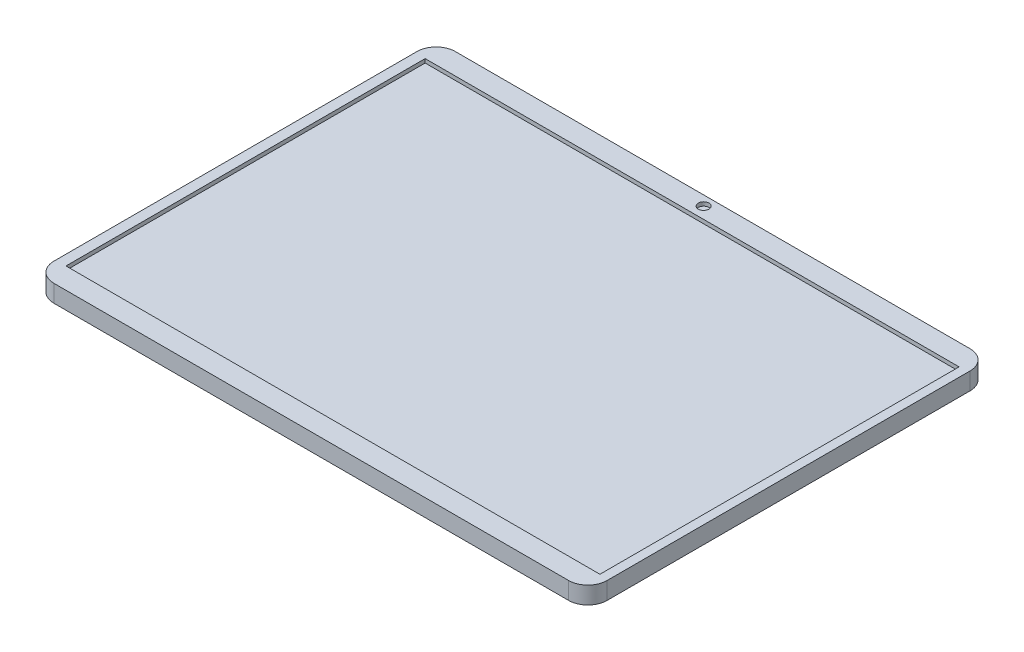
ISO-10303-21;
HEADER;
FILE_DESCRIPTION(('STEP AP214'),'2;1');
FILE_NAME('part.step','',(''),(''),'','','');
FILE_SCHEMA(('AUTOMOTIVE_DESIGN { 1 0 10303 214 1 1 1 1 }'));
ENDSEC;
DATA;
#1=APPLICATION_CONTEXT('core data for automotive mechanical design processes');
#2=APPLICATION_PROTOCOL_DEFINITION('international standard','automotive_design',2000,#1);
#3=PRODUCT_CONTEXT('',#1,'mechanical');
#4=PRODUCT('Part','Part','',(#3));
#5=PRODUCT_RELATED_PRODUCT_CATEGORY('part','',(#4));
#6=PRODUCT_DEFINITION_FORMATION('','',#4);
#7=PRODUCT_DEFINITION_CONTEXT('part definition',#1,'design');
#8=PRODUCT_DEFINITION('design','',#6,#7);
#9=PRODUCT_DEFINITION_SHAPE('','',#8);
#10=(LENGTH_UNIT() NAMED_UNIT(*) SI_UNIT(.MILLI.,.METRE.));
#11=(NAMED_UNIT(*) PLANE_ANGLE_UNIT() SI_UNIT($,.RADIAN.));
#12=(NAMED_UNIT(*) SI_UNIT($,.STERADIAN.) SOLID_ANGLE_UNIT());
#13=UNCERTAINTY_MEASURE_WITH_UNIT(LENGTH_MEASURE(1.E-05),#10,'distance_accuracy_value','');
#14=(GEOMETRIC_REPRESENTATION_CONTEXT(3) GLOBAL_UNCERTAINTY_ASSIGNED_CONTEXT((#13)) GLOBAL_UNIT_ASSIGNED_CONTEXT((#10,
#11,#12)) REPRESENTATION_CONTEXT('',''));
#15=CARTESIAN_POINT('',(0.,0.,0.));
#16=DIRECTION('',(0.,0.,1.));
#17=DIRECTION('',(1.,0.,0.));
#18=AXIS2_PLACEMENT_3D('',#15,#16,#17);
#19=CARTESIAN_POINT('',(-187.6,9.,-61.7999999999999));
#20=DIRECTION('',(1.,0.,0.));
#21=DIRECTION('',(0.,0.,-1.));
#22=AXIS2_PLACEMENT_3D('',#19,#20,#21);
#23=PLANE('',#22);
#24=DIRECTION('',(0.,1.,0.));
#25=VECTOR('',#24,1.);
#26=CARTESIAN_POINT('',(-187.6,0.,13.2));
#27=LINE('',#26,#25);
#28=CARTESIAN_POINT('',(-187.6,2.5,13.2));
#29=VERTEX_POINT('',#28);
#30=CARTESIAN_POINT('',(-187.6,6.5,13.2));
#31=VERTEX_POINT('',#30);
#32=EDGE_CURVE('E61',#29,#31,#27,.T.);
#33=ORIENTED_EDGE('',*,*,#32,.T.);
#34=DIRECTION('',(0.,0.,-1.));
#35=VECTOR('',#34,1.);
#36=CARTESIAN_POINT('',(-187.6,6.5,0.));
#37=LINE('',#36,#35);
#38=CARTESIAN_POINT('',(-187.6,6.5,23.2));
#39=VERTEX_POINT('',#38);
#40=EDGE_CURVE('E221',#39,#31,#37,.T.);
#41=ORIENTED_EDGE('',*,*,#40,.F.);
#42=DIRECTION('',(0.,1.,0.));
#43=VECTOR('',#42,1.);
#44=CARTESIAN_POINT('',(-187.6,0.,23.2));
#45=LINE('',#44,#43);
#46=CARTESIAN_POINT('',(-187.6,2.5,23.2));
#47=VERTEX_POINT('',#46);
#48=EDGE_CURVE('E218',#47,#39,#45,.T.);
#49=ORIENTED_EDGE('',*,*,#48,.F.);
#50=DIRECTION('',(0.,0.,-1.));
#51=VECTOR('',#50,1.);
#52=CARTESIAN_POINT('',(-187.6,2.5,0.));
#53=LINE('',#52,#51);
#54=EDGE_CURVE('E215',#47,#29,#53,.T.);
#55=ORIENTED_EDGE('',*,*,#54,.T.);
#56=EDGE_LOOP('',(#33,#41,#49,#55));
#57=FACE_BOUND('',#56,.T.);
#58=DIRECTION('',(0.,0.,1.));
#59=VECTOR('',#58,1.);
#60=CARTESIAN_POINT('',(-187.6,0.,-61.7999999999999));
#61=LINE('',#60,#59);
#62=CARTESIAN_POINT('',(-187.6,0.,-61.7999999999999));
#63=VERTEX_POINT('',#62);
#64=CARTESIAN_POINT('',(-187.6,0.,127.2));
#65=VERTEX_POINT('',#64);
#66=EDGE_CURVE('E304',#63,#65,#61,.T.);
#67=ORIENTED_EDGE('',*,*,#66,.T.);
#68=DIRECTION('',(0.,-1.,0.));
#69=VECTOR('',#68,1.);
#70=CARTESIAN_POINT('',(-187.6,9.,127.2));
#71=LINE('',#70,#69);
#72=CARTESIAN_POINT('',(-187.6,9.,127.2));
#73=VERTEX_POINT('',#72);
#74=EDGE_CURVE('E46',#73,#65,#71,.T.);
#75=ORIENTED_EDGE('',*,*,#74,.F.);
#76=DIRECTION('',(0.,0.,1.));
#77=VECTOR('',#76,1.);
#78=CARTESIAN_POINT('',(-187.6,9.,-61.7999999999999));
#79=LINE('',#78,#77);
#80=CARTESIAN_POINT('',(-187.6,9.,-61.7999999999999));
#81=VERTEX_POINT('',#80);
#82=EDGE_CURVE('E283',#81,#73,#79,.T.);
#83=ORIENTED_EDGE('',*,*,#82,.F.);
#84=DIRECTION('',(0.,-1.,0.));
#85=VECTOR('',#84,1.);
#86=CARTESIAN_POINT('',(-187.6,9.,-61.7999999999999));
#87=LINE('',#86,#85);
#88=EDGE_CURVE('E11',#81,#63,#87,.T.);
#89=ORIENTED_EDGE('',*,*,#88,.T.);
#90=EDGE_LOOP('',(#67,#75,#83,#89));
#91=FACE_BOUND('',#90,.T.);
#92=DIRECTION('',(0.,-1.,0.));
#93=VECTOR('',#92,1.);
#94=CARTESIAN_POINT('',(-187.6,0.,-6.8));
#95=LINE('',#94,#93);
#96=CARTESIAN_POINT('',(-187.6,6.5,-6.8));
#97=VERTEX_POINT('',#96);
#98=CARTESIAN_POINT('',(-187.6,2.5,-6.8));
#99=VERTEX_POINT('',#98);
#100=EDGE_CURVE('E53',#97,#99,#95,.T.);
#101=ORIENTED_EDGE('',*,*,#100,.T.);
#102=DIRECTION('',(0.,0.,1.));
#103=VECTOR('',#102,1.);
#104=CARTESIAN_POINT('',(-187.6,2.5,0.));
#105=LINE('',#104,#103);
#106=CARTESIAN_POINT('',(-187.6,2.5,-16.8));
#107=VERTEX_POINT('',#106);
#108=EDGE_CURVE('E196',#107,#99,#105,.T.);
#109=ORIENTED_EDGE('',*,*,#108,.F.);
#110=DIRECTION('',(0.,-1.,0.));
#111=VECTOR('',#110,1.);
#112=CARTESIAN_POINT('',(-187.6,0.,-16.8));
#113=LINE('',#112,#111);
#114=CARTESIAN_POINT('',(-187.6,6.5,-16.8));
#115=VERTEX_POINT('',#114);
#116=EDGE_CURVE('E181',#115,#107,#113,.T.);
#117=ORIENTED_EDGE('',*,*,#116,.F.);
#118=DIRECTION('',(0.,0.,1.));
#119=VECTOR('',#118,1.);
#120=CARTESIAN_POINT('',(-187.6,6.5,0.));
#121=LINE('',#120,#119);
#122=EDGE_CURVE('E191',#115,#97,#121,.T.);
#123=ORIENTED_EDGE('',*,*,#122,.T.);
#124=EDGE_LOOP('',(#101,#109,#117,#123));
#125=FACE_BOUND('',#124,.T.);
#126=ADVANCED_FACE('F38',(#57,#91,#125),#23,.F.);
#127=CARTESIAN_POINT('',(-177.6,9.,-61.8));
#128=DIRECTION('',(0.,-1.,0.));
#129=DIRECTION('',(0.,0.,-1.));
#130=AXIS2_PLACEMENT_3D('',#127,#128,#129);
#131=CYLINDRICAL_SURFACE('',#130,10.);
#132=CARTESIAN_POINT('',(-177.6,0.,-61.8));
#133=DIRECTION('',(0.,1.,0.));
#134=DIRECTION('',(0.,0.,1.));
#135=AXIS2_PLACEMENT_3D('',#132,#133,#134);
#136=CIRCLE('',#135,10.);
#137=CARTESIAN_POINT('',(-177.6,0.,-71.8));
#138=VERTEX_POINT('',#137);
#139=EDGE_CURVE('E245',#138,#63,#136,.T.);
#140=ORIENTED_EDGE('',*,*,#139,.T.);
#141=ORIENTED_EDGE('',*,*,#88,.F.);
#142=CARTESIAN_POINT('',(-177.6,9.,-61.8));
#143=DIRECTION('',(0.,1.,0.));
#144=DIRECTION('',(0.,0.,1.));
#145=AXIS2_PLACEMENT_3D('',#142,#143,#144);
#146=CIRCLE('',#145,10.);
#147=CARTESIAN_POINT('',(-177.6,9.,-71.8));
#148=VERTEX_POINT('',#147);
#149=EDGE_CURVE('E280',#148,#81,#146,.T.);
#150=ORIENTED_EDGE('',*,*,#149,.F.);
#151=DIRECTION('',(0.,-1.,0.));
#152=VECTOR('',#151,1.);
#153=CARTESIAN_POINT('',(-177.6,9.,-71.8));
#154=LINE('',#153,#152);
#155=EDGE_CURVE('E301',#148,#138,#154,.T.);
#156=ORIENTED_EDGE('',*,*,#155,.T.);
#157=EDGE_LOOP('',(#140,#141,#150,#156));
#158=FACE_BOUND('',#157,.T.);
#159=ADVANCED_FACE('F40',(#158),#131,.T.);
#160=CARTESIAN_POINT('',(-177.6,9.,127.2));
#161=DIRECTION('',(0.,-1.,0.));
#162=DIRECTION('',(0.,0.,-1.));
#163=AXIS2_PLACEMENT_3D('',#160,#161,#162);
#164=CYLINDRICAL_SURFACE('',#163,10.);
#165=CARTESIAN_POINT('',(-177.6,0.,127.2));
#166=DIRECTION('',(0.,1.,0.));
#167=DIRECTION('',(0.,0.,1.));
#168=AXIS2_PLACEMENT_3D('',#165,#166,#167);
#169=CIRCLE('',#168,10.);
#170=CARTESIAN_POINT('',(-177.6,0.,137.2));
#171=VERTEX_POINT('',#170);
#172=EDGE_CURVE('E306',#65,#171,#169,.T.);
#173=ORIENTED_EDGE('',*,*,#172,.T.);
#174=DIRECTION('',(0.,-1.,0.));
#175=VECTOR('',#174,1.);
#176=CARTESIAN_POINT('',(-177.6,9.,137.2));
#177=LINE('',#176,#175);
#178=CARTESIAN_POINT('',(-177.6,9.,137.2));
#179=VERTEX_POINT('',#178);
#180=EDGE_CURVE('E331',#179,#171,#177,.T.);
#181=ORIENTED_EDGE('',*,*,#180,.F.);
#182=CARTESIAN_POINT('',(-177.6,9.,127.2));
#183=DIRECTION('',(0.,1.,0.));
#184=DIRECTION('',(0.,0.,1.));
#185=AXIS2_PLACEMENT_3D('',#182,#183,#184);
#186=CIRCLE('',#185,10.);
#187=EDGE_CURVE('E286',#73,#179,#186,.T.);
#188=ORIENTED_EDGE('',*,*,#187,.F.);
#189=ORIENTED_EDGE('',*,*,#74,.T.);
#190=EDGE_LOOP('',(#173,#181,#188,#189));
#191=FACE_BOUND('',#190,.T.);
#192=ADVANCED_FACE('F338',(#191),#164,.T.);
#193=CARTESIAN_POINT('',(-177.6,9.,137.2));
#194=DIRECTION('',(0.,0.,-1.));
#195=DIRECTION('',(-1.,0.,0.));
#196=AXIS2_PLACEMENT_3D('',#193,#194,#195);
#197=PLANE('',#196);
#198=DIRECTION('',(1.,0.,0.));
#199=VECTOR('',#198,1.);
#200=CARTESIAN_POINT('',(-177.6,0.,137.2));
#201=LINE('',#200,#199);
#202=CARTESIAN_POINT('',(90.3999999999999,0.,137.2));
#203=VERTEX_POINT('',#202);
#204=EDGE_CURVE('E308',#171,#203,#201,.T.);
#205=ORIENTED_EDGE('',*,*,#204,.T.);
#206=DIRECTION('',(0.,-1.,0.));
#207=VECTOR('',#206,1.);
#208=CARTESIAN_POINT('',(90.3999999999999,9.,137.2));
#209=LINE('',#208,#207);
#210=CARTESIAN_POINT('',(90.3999999999999,9.,137.2));
#211=VERTEX_POINT('',#210);
#212=EDGE_CURVE('E328',#211,#203,#209,.T.);
#213=ORIENTED_EDGE('',*,*,#212,.F.);
#214=DIRECTION('',(1.,0.,0.));
#215=VECTOR('',#214,1.);
#216=CARTESIAN_POINT('',(-177.6,9.,137.2));
#217=LINE('',#216,#215);
#218=EDGE_CURVE('E288',#179,#211,#217,.T.);
#219=ORIENTED_EDGE('',*,*,#218,.F.);
#220=ORIENTED_EDGE('',*,*,#180,.T.);
#221=EDGE_LOOP('',(#205,#213,#219,#220));
#222=FACE_BOUND('',#221,.T.);
#223=ADVANCED_FACE('F348',(#222),#197,.F.);
#224=CARTESIAN_POINT('',(90.4,9.,127.2));
#225=DIRECTION('',(0.,-1.,0.));
#226=DIRECTION('',(0.,0.,-1.));
#227=AXIS2_PLACEMENT_3D('',#224,#225,#226);
#228=CYLINDRICAL_SURFACE('',#227,10.);
#229=CARTESIAN_POINT('',(90.4,0.,127.2));
#230=DIRECTION('',(0.,1.,0.));
#231=DIRECTION('',(0.,0.,1.));
#232=AXIS2_PLACEMENT_3D('',#229,#230,#231);
#233=CIRCLE('',#232,10.);
#234=CARTESIAN_POINT('',(100.4,0.,127.2));
#235=VERTEX_POINT('',#234);
#236=EDGE_CURVE('E310',#203,#235,#233,.T.);
#237=ORIENTED_EDGE('',*,*,#236,.T.);
#238=DIRECTION('',(0.,-1.,0.));
#239=VECTOR('',#238,1.);
#240=CARTESIAN_POINT('',(100.4,9.,127.2));
#241=LINE('',#240,#239);
#242=CARTESIAN_POINT('',(100.4,9.,127.2));
#243=VERTEX_POINT('',#242);
#244=EDGE_CURVE('E326',#243,#235,#241,.T.);
#245=ORIENTED_EDGE('',*,*,#244,.F.);
#246=CARTESIAN_POINT('',(90.4,9.,127.2));
#247=DIRECTION('',(0.,1.,0.));
#248=DIRECTION('',(0.,0.,1.));
#249=AXIS2_PLACEMENT_3D('',#246,#247,#248);
#250=CIRCLE('',#249,10.);
#251=EDGE_CURVE('E290',#211,#243,#250,.T.);
#252=ORIENTED_EDGE('',*,*,#251,.F.);
#253=ORIENTED_EDGE('',*,*,#212,.T.);
#254=EDGE_LOOP('',(#237,#245,#252,#253));
#255=FACE_BOUND('',#254,.T.);
#256=ADVANCED_FACE('F352',(#255),#228,.T.);
#257=CARTESIAN_POINT('',(100.4,9.,-61.7999999999999));
#258=DIRECTION('',(1.,0.,0.));
#259=DIRECTION('',(0.,0.,-1.));
#260=AXIS2_PLACEMENT_3D('',#257,#258,#259);
#261=PLANE('',#260);
#262=DIRECTION('',(0.,0.,1.));
#263=VECTOR('',#262,1.);
#264=CARTESIAN_POINT('',(100.4,0.,-61.7999999999999));
#265=LINE('',#264,#263);
#266=CARTESIAN_POINT('',(100.4,0.,-61.7999999999999));
#267=VERTEX_POINT('',#266);
#268=EDGE_CURVE('E313',#267,#235,#265,.T.);
#269=ORIENTED_EDGE('',*,*,#268,.F.);
#270=DIRECTION('',(0.,-1.,0.));
#271=VECTOR('',#270,1.);
#272=CARTESIAN_POINT('',(100.4,9.,-61.7999999999999));
#273=LINE('',#272,#271);
#274=CARTESIAN_POINT('',(100.4,9.,-61.7999999999999));
#275=VERTEX_POINT('',#274);
#276=EDGE_CURVE('E324',#275,#267,#273,.T.);
#277=ORIENTED_EDGE('',*,*,#276,.F.);
#278=DIRECTION('',(0.,0.,1.));
#279=VECTOR('',#278,1.);
#280=CARTESIAN_POINT('',(100.4,9.,-61.7999999999999));
#281=LINE('',#280,#279);
#282=EDGE_CURVE('E292',#275,#243,#281,.T.);
#283=ORIENTED_EDGE('',*,*,#282,.T.);
#284=ORIENTED_EDGE('',*,*,#244,.T.);
#285=EDGE_LOOP('',(#269,#277,#283,#284));
#286=FACE_BOUND('',#285,.T.);
#287=ADVANCED_FACE('F370',(#286),#261,.T.);
#288=CARTESIAN_POINT('',(90.4,9.,-61.8));
#289=DIRECTION('',(0.,-1.,0.));
#290=DIRECTION('',(0.,0.,-1.));
#291=AXIS2_PLACEMENT_3D('',#288,#289,#290);
#292=CYLINDRICAL_SURFACE('',#291,9.99999999999999);
#293=CARTESIAN_POINT('',(90.4,0.,-61.8));
#294=DIRECTION('',(0.,-1.,0.));
#295=DIRECTION('',(0.,0.,-1.));
#296=AXIS2_PLACEMENT_3D('',#293,#294,#295);
#297=CIRCLE('',#296,9.99999999999999);
#298=CARTESIAN_POINT('',(90.3999999999999,0.,-71.8));
#299=VERTEX_POINT('',#298);
#300=EDGE_CURVE('E316',#299,#267,#297,.T.);
#301=ORIENTED_EDGE('',*,*,#300,.F.);
#302=DIRECTION('',(0.,-1.,0.));
#303=VECTOR('',#302,1.);
#304=CARTESIAN_POINT('',(90.3999999999999,9.,-71.8));
#305=LINE('',#304,#303);
#306=CARTESIAN_POINT('',(90.3999999999999,9.,-71.8));
#307=VERTEX_POINT('',#306);
#308=EDGE_CURVE('E322',#307,#299,#305,.T.);
#309=ORIENTED_EDGE('',*,*,#308,.F.);
#310=CARTESIAN_POINT('',(90.4,9.,-61.8));
#311=DIRECTION('',(0.,-1.,0.));
#312=DIRECTION('',(0.,0.,-1.));
#313=AXIS2_PLACEMENT_3D('',#310,#311,#312);
#314=CIRCLE('',#313,9.99999999999999);
#315=EDGE_CURVE('E295',#307,#275,#314,.T.);
#316=ORIENTED_EDGE('',*,*,#315,.T.);
#317=ORIENTED_EDGE('',*,*,#276,.T.);
#318=EDGE_LOOP('',(#301,#309,#316,#317));
#319=FACE_BOUND('',#318,.T.);
#320=ADVANCED_FACE('F367',(#319),#292,.T.);
#321=CARTESIAN_POINT('',(-177.6,9.,-71.8));
#322=DIRECTION('',(0.,0.,-1.));
#323=DIRECTION('',(-1.,0.,0.));
#324=AXIS2_PLACEMENT_3D('',#321,#322,#323);
#325=PLANE('',#324);
#326=DIRECTION('',(1.,0.,0.));
#327=VECTOR('',#326,1.);
#328=CARTESIAN_POINT('',(-177.6,0.,-71.8));
#329=LINE('',#328,#327);
#330=EDGE_CURVE('E284',#138,#299,#329,.T.);
#331=ORIENTED_EDGE('',*,*,#330,.F.);
#332=ORIENTED_EDGE('',*,*,#155,.F.);
#333=DIRECTION('',(1.,0.,0.));
#334=VECTOR('',#333,1.);
#335=CARTESIAN_POINT('',(-177.6,9.,-71.8));
#336=LINE('',#335,#334);
#337=EDGE_CURVE('E298',#148,#307,#336,.T.);
#338=ORIENTED_EDGE('',*,*,#337,.T.);
#339=ORIENTED_EDGE('',*,*,#308,.T.);
#340=EDGE_LOOP('',(#331,#332,#338,#339));
#341=FACE_BOUND('',#340,.T.);
#342=ADVANCED_FACE('F364',(#341),#325,.T.);
#343=CARTESIAN_POINT('',(-177.6,9.,-61.8));
#344=DIRECTION('',(0.,1.,0.));
#345=DIRECTION('',(0.,0.,1.));
#346=AXIS2_PLACEMENT_3D('',#343,#344,#345);
#347=PLANE('',#346);
#348=CARTESIAN_POINT('',(-43.2807643260675,9.,-66.7577070217975));
#349=DIRECTION('',(0.,1.,0.));
#350=DIRECTION('',(0.,0.,1.));
#351=AXIS2_PLACEMENT_3D('',#348,#349,#350);
#352=CIRCLE('',#351,2.76679822461764);
#353=CARTESIAN_POINT('',(-43.2807643260675,9.,-63.9909087971798));
#354=VERTEX_POINT('',#353);
#355=EDGE_CURVE('E246',#354,#354,#352,.T.);
#356=ORIENTED_EDGE('',*,*,#355,.F.);
#357=EDGE_LOOP('',(#356));
#358=FACE_BOUND('',#357,.T.);
#359=DIRECTION('',(0.,0.,-1.));
#360=VECTOR('',#359,1.);
#361=CARTESIAN_POINT('',(95.7192356739325,9.,0.));
#362=LINE('',#361,#360);
#363=CARTESIAN_POINT('',(95.7192356739325,9.,126.242292978202));
#364=VERTEX_POINT('',#363);
#365=CARTESIAN_POINT('',(95.7192356739325,9.,-60.7577070217975));
#366=VERTEX_POINT('',#365);
#367=EDGE_CURVE('E204',#364,#366,#362,.T.);
#368=ORIENTED_EDGE('',*,*,#367,.F.);
#369=DIRECTION('',(1.,0.,0.));
#370=VECTOR('',#369,1.);
#371=CARTESIAN_POINT('',(0.,9.,126.242292978202));
#372=LINE('',#371,#370);
#373=CARTESIAN_POINT('',(-182.280764326067,9.,126.242292978202));
#374=VERTEX_POINT('',#373);
#375=EDGE_CURVE('E254',#374,#364,#372,.T.);
#376=ORIENTED_EDGE('',*,*,#375,.F.);
#377=DIRECTION('',(0.,0.,1.));
#378=VECTOR('',#377,1.);
#379=CARTESIAN_POINT('',(-182.280764326067,9.,0.));
#380=LINE('',#379,#378);
#381=CARTESIAN_POINT('',(-182.280764326067,9.,-60.7577070217975));
#382=VERTEX_POINT('',#381);
#383=EDGE_CURVE('E268',#382,#374,#380,.T.);
#384=ORIENTED_EDGE('',*,*,#383,.F.);
#385=DIRECTION('',(-1.,0.,0.));
#386=VECTOR('',#385,1.);
#387=CARTESIAN_POINT('',(0.,9.,-60.7577070217975));
#388=LINE('',#387,#386);
#389=EDGE_CURVE('E265',#366,#382,#388,.T.);
#390=ORIENTED_EDGE('',*,*,#389,.F.);
#391=EDGE_LOOP('',(#368,#376,#384,#390));
#392=FACE_BOUND('',#391,.T.);
#393=ORIENTED_EDGE('',*,*,#149,.T.);
#394=ORIENTED_EDGE('',*,*,#82,.T.);
#395=ORIENTED_EDGE('',*,*,#187,.T.);
#396=ORIENTED_EDGE('',*,*,#218,.T.);
#397=ORIENTED_EDGE('',*,*,#251,.T.);
#398=ORIENTED_EDGE('',*,*,#282,.F.);
#399=ORIENTED_EDGE('',*,*,#315,.F.);
#400=ORIENTED_EDGE('',*,*,#337,.F.);
#401=EDGE_LOOP('',(#393,#394,#395,#396,#397,#398,#399,#400));
#402=FACE_BOUND('',#401,.T.);
#403=ADVANCED_FACE('F356',(#358,#392,#402),#347,.T.);
#404=CARTESIAN_POINT('',(-177.6,0.,-61.8));
#405=DIRECTION('',(0.,1.,0.));
#406=DIRECTION('',(0.,0.,1.));
#407=AXIS2_PLACEMENT_3D('',#404,#405,#406);
#408=PLANE('',#407);
#409=ORIENTED_EDGE('',*,*,#139,.F.);
#410=ORIENTED_EDGE('',*,*,#330,.T.);
#411=ORIENTED_EDGE('',*,*,#300,.T.);
#412=ORIENTED_EDGE('',*,*,#268,.T.);
#413=ORIENTED_EDGE('',*,*,#236,.F.);
#414=ORIENTED_EDGE('',*,*,#204,.F.);
#415=ORIENTED_EDGE('',*,*,#172,.F.);
#416=ORIENTED_EDGE('',*,*,#66,.F.);
#417=EDGE_LOOP('',(#409,#410,#411,#412,#413,#414,#415,#416));
#418=FACE_BOUND('',#417,.T.);
#419=ADVANCED_FACE('F344',(#418),#408,.F.);
#420=CARTESIAN_POINT('',(95.7192356739325,7.,0.));
#421=DIRECTION('',(1.,0.,0.));
#422=DIRECTION('',(0.,0.,-1.));
#423=AXIS2_PLACEMENT_3D('',#420,#421,#422);
#424=PLANE('',#423);
#425=ORIENTED_EDGE('',*,*,#367,.T.);
#426=DIRECTION('',(0.,1.,0.));
#427=VECTOR('',#426,1.);
#428=CARTESIAN_POINT('',(95.7192356739325,7.,-60.7577070217975));
#429=LINE('',#428,#427);
#430=CARTESIAN_POINT('',(95.7192356739325,7.,-60.7577070217975));
#431=VERTEX_POINT('',#430);
#432=EDGE_CURVE('E263',#431,#366,#429,.T.);
#433=ORIENTED_EDGE('',*,*,#432,.F.);
#434=DIRECTION('',(0.,0.,-1.));
#435=VECTOR('',#434,1.);
#436=CARTESIAN_POINT('',(95.7192356739325,7.,0.));
#437=LINE('',#436,#435);
#438=CARTESIAN_POINT('',(95.7192356739325,7.,126.242292978202));
#439=VERTEX_POINT('',#438);
#440=EDGE_CURVE('E250',#439,#431,#437,.T.);
#441=ORIENTED_EDGE('',*,*,#440,.F.);
#442=DIRECTION('',(0.,1.,0.));
#443=VECTOR('',#442,1.);
#444=CARTESIAN_POINT('',(95.7192356739325,7.,126.242292978202));
#445=LINE('',#444,#443);
#446=EDGE_CURVE('E249',#439,#364,#445,.T.);
#447=ORIENTED_EDGE('',*,*,#446,.T.);
#448=EDGE_LOOP('',(#425,#433,#441,#447));
#449=FACE_BOUND('',#448,.T.);
#450=ADVANCED_FACE('F427',(#449),#424,.F.);
#451=CARTESIAN_POINT('',(0.,7.,126.242292978202));
#452=DIRECTION('',(0.,0.,1.));
#453=DIRECTION('',(1.,0.,0.));
#454=AXIS2_PLACEMENT_3D('',#451,#452,#453);
#455=PLANE('',#454);
#456=ORIENTED_EDGE('',*,*,#375,.T.);
#457=ORIENTED_EDGE('',*,*,#446,.F.);
#458=DIRECTION('',(1.,0.,0.));
#459=VECTOR('',#458,1.);
#460=CARTESIAN_POINT('',(0.,7.,126.242292978202));
#461=LINE('',#460,#459);
#462=CARTESIAN_POINT('',(-182.280764326067,7.,126.242292978202));
#463=VERTEX_POINT('',#462);
#464=EDGE_CURVE('E260',#463,#439,#461,.T.);
#465=ORIENTED_EDGE('',*,*,#464,.F.);
#466=DIRECTION('',(0.,1.,0.));
#467=VECTOR('',#466,1.);
#468=CARTESIAN_POINT('',(-182.280764326067,7.,126.242292978202));
#469=LINE('',#468,#467);
#470=EDGE_CURVE('E274',#463,#374,#469,.T.);
#471=ORIENTED_EDGE('',*,*,#470,.T.);
#472=EDGE_LOOP('',(#456,#457,#465,#471));
#473=FACE_BOUND('',#472,.T.);
#474=ADVANCED_FACE('F444',(#473),#455,.F.);
#475=CARTESIAN_POINT('',(-182.280764326067,7.,0.));
#476=DIRECTION('',(-1.,0.,0.));
#477=DIRECTION('',(0.,0.,1.));
#478=AXIS2_PLACEMENT_3D('',#475,#476,#477);
#479=PLANE('',#478);
#480=ORIENTED_EDGE('',*,*,#383,.T.);
#481=ORIENTED_EDGE('',*,*,#470,.F.);
#482=DIRECTION('',(0.,0.,1.));
#483=VECTOR('',#482,1.);
#484=CARTESIAN_POINT('',(-182.280764326067,7.,0.));
#485=LINE('',#484,#483);
#486=CARTESIAN_POINT('',(-182.280764326067,7.,-60.7577070217975));
#487=VERTEX_POINT('',#486);
#488=EDGE_CURVE('E257',#487,#463,#485,.T.);
#489=ORIENTED_EDGE('',*,*,#488,.F.);
#490=DIRECTION('',(0.,1.,0.));
#491=VECTOR('',#490,1.);
#492=CARTESIAN_POINT('',(-182.280764326067,7.,-60.7577070217975));
#493=LINE('',#492,#491);
#494=EDGE_CURVE('E276',#487,#382,#493,.T.);
#495=ORIENTED_EDGE('',*,*,#494,.T.);
#496=EDGE_LOOP('',(#480,#481,#489,#495));
#497=FACE_BOUND('',#496,.T.);
#498=ADVANCED_FACE('F454',(#497),#479,.F.);
#499=CARTESIAN_POINT('',(0.,7.,-60.7577070217975));
#500=DIRECTION('',(0.,0.,-1.));
#501=DIRECTION('',(-1.,0.,0.));
#502=AXIS2_PLACEMENT_3D('',#499,#500,#501);
#503=PLANE('',#502);
#504=ORIENTED_EDGE('',*,*,#389,.T.);
#505=ORIENTED_EDGE('',*,*,#494,.F.);
#506=DIRECTION('',(-1.,0.,0.));
#507=VECTOR('',#506,1.);
#508=CARTESIAN_POINT('',(0.,7.,-60.7577070217975));
#509=LINE('',#508,#507);
#510=EDGE_CURVE('E253',#431,#487,#509,.T.);
#511=ORIENTED_EDGE('',*,*,#510,.F.);
#512=ORIENTED_EDGE('',*,*,#432,.T.);
#513=EDGE_LOOP('',(#504,#505,#511,#512));
#514=FACE_BOUND('',#513,.T.);
#515=ADVANCED_FACE('F464',(#514),#503,.F.);
#516=CARTESIAN_POINT('',(0.,7.,0.));
#517=DIRECTION('',(0.,1.,0.));
#518=DIRECTION('',(0.,0.,1.));
#519=AXIS2_PLACEMENT_3D('',#516,#517,#518);
#520=PLANE('',#519);
#521=ORIENTED_EDGE('',*,*,#440,.T.);
#522=ORIENTED_EDGE('',*,*,#510,.T.);
#523=ORIENTED_EDGE('',*,*,#488,.T.);
#524=ORIENTED_EDGE('',*,*,#464,.T.);
#525=EDGE_LOOP('',(#521,#522,#523,#524));
#526=FACE_BOUND('',#525,.T.);
#527=ADVANCED_FACE('F474',(#526),#520,.T.);
#528=CARTESIAN_POINT('',(-43.2807643260675,7.,-66.7577070217975));
#529=DIRECTION('',(0.,1.,0.));
#530=DIRECTION('',(0.,0.,1.));
#531=AXIS2_PLACEMENT_3D('',#528,#529,#530);
#532=CYLINDRICAL_SURFACE('',#531,2.76679822461764);
#533=CARTESIAN_POINT('',(-43.2807643260675,7.,-66.7577070217975));
#534=DIRECTION('',(0.,1.,0.));
#535=DIRECTION('',(0.,0.,1.));
#536=AXIS2_PLACEMENT_3D('',#533,#534,#535);
#537=CIRCLE('',#536,2.76679822461764);
#538=CARTESIAN_POINT('',(-43.2807643260675,7.,-63.9909087971798));
#539=VERTEX_POINT('',#538);
#540=EDGE_CURVE('E242',#539,#539,#537,.T.);
#541=ORIENTED_EDGE('',*,*,#540,.F.);
#542=EDGE_LOOP('',(#541));
#543=FACE_BOUND('',#542,.T.);
#544=ORIENTED_EDGE('',*,*,#355,.T.);
#545=EDGE_LOOP('',(#544));
#546=FACE_BOUND('',#545,.T.);
#547=ADVANCED_FACE('F484',(#543,#546),#532,.F.);
#548=CARTESIAN_POINT('',(0.,7.,0.));
#549=DIRECTION('',(0.,1.,0.));
#550=DIRECTION('',(0.,0.,1.));
#551=AXIS2_PLACEMENT_3D('',#548,#549,#550);
#552=PLANE('',#551);
#553=ORIENTED_EDGE('',*,*,#540,.T.);
#554=EDGE_LOOP('',(#553));
#555=FACE_BOUND('',#554,.T.);
#556=ADVANCED_FACE('F493',(#555),#552,.T.);
#557=CARTESIAN_POINT('',(-187.6,0.,13.2));
#558=DIRECTION('',(0.325568154457157,0.,-0.945518575599317));
#559=DIRECTION('',(-0.945518575599317,0.,-0.325568154457157));
#560=AXIS2_PLACEMENT_3D('',#557,#558,#559);
#561=PLANE('',#560);
#562=ORIENTED_EDGE('',*,*,#32,.F.);
#563=DIRECTION('',(-0.899070105815378,-0.309574663715496,-0.309574663715496));
#564=VECTOR('',#563,1.);
#565=CARTESIAN_POINT('',(-188.295823314161,2.26040881896359,12.9604088189636));
#566=LINE('',#565,#564);
#567=CARTESIAN_POINT('',(-185.6,3.18865522657933,13.8886552265793));
#568=VERTEX_POINT('',#567);
#569=EDGE_CURVE('E228',#568,#29,#566,.T.);
#570=ORIENTED_EDGE('',*,*,#569,.F.);
#571=DIRECTION('',(0.,-1.,0.));
#572=VECTOR('',#571,1.);
#573=CARTESIAN_POINT('',(-185.6,0.,13.8886552265793));
#574=LINE('',#573,#572);
#575=CARTESIAN_POINT('',(-185.6,5.81134477342067,13.8886552265793));
#576=VERTEX_POINT('',#575);
#577=EDGE_CURVE('E224',#568,#576,#574,.F.);
#578=ORIENTED_EDGE('',*,*,#577,.T.);
#579=DIRECTION('',(0.899070105815378,-0.309574663715496,0.309574663715496));
#580=VECTOR('',#579,1.);
#581=CARTESIAN_POINT('',(-185.790859383181,5.87706292930534,13.8229370706947));
#582=LINE('',#581,#580);
#583=EDGE_CURVE('E225',#576,#31,#582,.F.);
#584=ORIENTED_EDGE('',*,*,#583,.T.);
#585=EDGE_LOOP('',(#562,#570,#578,#584));
#586=FACE_BOUND('',#585,.T.);
#587=ADVANCED_FACE('F503',(#586),#561,.F.);
#588=CARTESIAN_POINT('',(-187.6,6.5,0.));
#589=DIRECTION('',(0.325568154457157,0.945518575599317,0.));
#590=DIRECTION('',(-0.945518575599317,0.325568154457157,0.));
#591=AXIS2_PLACEMENT_3D('',#588,#589,#590);
#592=PLANE('',#591);
#593=ORIENTED_EDGE('',*,*,#40,.T.);
#594=ORIENTED_EDGE('',*,*,#583,.F.);
#595=DIRECTION('',(0.,0.,-1.));
#596=VECTOR('',#595,1.);
#597=CARTESIAN_POINT('',(-185.6,5.81134477342067,0.));
#598=LINE('',#597,#596);
#599=CARTESIAN_POINT('',(-185.6,5.81134477342067,22.5113447734207));
#600=VERTEX_POINT('',#599);
#601=EDGE_CURVE('E231',#600,#576,#598,.T.);
#602=ORIENTED_EDGE('',*,*,#601,.F.);
#603=DIRECTION('',(-0.899070105815378,0.309574663715496,0.309574663715496));
#604=VECTOR('',#603,1.);
#605=CARTESIAN_POINT('',(-185.790859383181,5.87706292930535,22.5770629293053));
#606=LINE('',#605,#604);
#607=EDGE_CURVE('E227',#600,#39,#606,.T.);
#608=ORIENTED_EDGE('',*,*,#607,.T.);
#609=EDGE_LOOP('',(#593,#594,#602,#608));
#610=FACE_BOUND('',#609,.T.);
#611=ADVANCED_FACE('F517',(#610),#592,.F.);
#612=CARTESIAN_POINT('',(-187.6,0.,23.2));
#613=DIRECTION('',(0.325568154457157,0.,0.945518575599317));
#614=DIRECTION('',(0.945518575599317,0.,-0.325568154457157));
#615=AXIS2_PLACEMENT_3D('',#612,#613,#614);
#616=PLANE('',#615);
#617=ORIENTED_EDGE('',*,*,#48,.T.);
#618=ORIENTED_EDGE('',*,*,#607,.F.);
#619=DIRECTION('',(0.,1.,0.));
#620=VECTOR('',#619,1.);
#621=CARTESIAN_POINT('',(-185.6,0.,22.5113447734207));
#622=LINE('',#621,#620);
#623=CARTESIAN_POINT('',(-185.6,3.18865522657933,22.5113447734207));
#624=VERTEX_POINT('',#623);
#625=EDGE_CURVE('E238',#624,#600,#622,.T.);
#626=ORIENTED_EDGE('',*,*,#625,.F.);
#627=DIRECTION('',(0.899070105815378,0.309574663715496,-0.309574663715496));
#628=VECTOR('',#627,1.);
#629=CARTESIAN_POINT('',(-188.295823314161,2.26040881896359,23.4395911810364));
#630=LINE('',#629,#628);
#631=EDGE_CURVE('E230',#624,#47,#630,.F.);
#632=ORIENTED_EDGE('',*,*,#631,.T.);
#633=EDGE_LOOP('',(#617,#618,#626,#632));
#634=FACE_BOUND('',#633,.T.);
#635=ADVANCED_FACE('F523',(#634),#616,.F.);
#636=CARTESIAN_POINT('',(-187.6,2.5,0.));
#637=DIRECTION('',(0.325568154457157,-0.945518575599317,0.));
#638=DIRECTION('',(0.945518575599317,0.325568154457157,0.));
#639=AXIS2_PLACEMENT_3D('',#636,#637,#638);
#640=PLANE('',#639);
#641=ORIENTED_EDGE('',*,*,#54,.F.);
#642=ORIENTED_EDGE('',*,*,#631,.F.);
#643=DIRECTION('',(0.,0.,1.));
#644=VECTOR('',#643,1.);
#645=CARTESIAN_POINT('',(-185.6,3.18865522657933,0.));
#646=LINE('',#645,#644);
#647=EDGE_CURVE('E235',#624,#568,#646,.F.);
#648=ORIENTED_EDGE('',*,*,#647,.T.);
#649=ORIENTED_EDGE('',*,*,#569,.T.);
#650=EDGE_LOOP('',(#641,#642,#648,#649));
#651=FACE_BOUND('',#650,.T.);
#652=ADVANCED_FACE('F531',(#651),#640,.F.);
#653=CARTESIAN_POINT('',(-185.6,0.,0.));
#654=DIRECTION('',(-1.,0.,0.));
#655=DIRECTION('',(0.,0.,1.));
#656=AXIS2_PLACEMENT_3D('',#653,#654,#655);
#657=PLANE('',#656);
#658=ORIENTED_EDGE('',*,*,#577,.F.);
#659=ORIENTED_EDGE('',*,*,#647,.F.);
#660=ORIENTED_EDGE('',*,*,#625,.T.);
#661=ORIENTED_EDGE('',*,*,#601,.T.);
#662=EDGE_LOOP('',(#658,#659,#660,#661));
#663=FACE_BOUND('',#662,.T.);
#664=ADVANCED_FACE('F539',(#663),#657,.T.);
#665=CARTESIAN_POINT('',(-187.6,0.,-6.8));
#666=DIRECTION('',(0.325568154457157,0.,0.945518575599317));
#667=DIRECTION('',(0.945518575599317,0.,-0.325568154457157));
#668=AXIS2_PLACEMENT_3D('',#665,#666,#667);
#669=PLANE('',#668);
#670=ORIENTED_EDGE('',*,*,#100,.F.);
#671=DIRECTION('',(-0.899070105815378,0.309574663715496,0.309574663715496));
#672=VECTOR('',#671,1.);
#673=CARTESIAN_POINT('',(-185.790859383181,5.87706292930534,-7.42293707069466));
#674=LINE('',#673,#672);
#675=CARTESIAN_POINT('',(-185.6,5.81134477342067,-7.48865522657933));
#676=VERTEX_POINT('',#675);
#677=EDGE_CURVE('E188',#676,#97,#674,.T.);
#678=ORIENTED_EDGE('',*,*,#677,.F.);
#679=DIRECTION('',(0.,1.,0.));
#680=VECTOR('',#679,1.);
#681=CARTESIAN_POINT('',(-185.6,0.,-7.48865522657933));
#682=LINE('',#681,#680);
#683=CARTESIAN_POINT('',(-185.6,3.18865522657933,-7.48865522657933));
#684=VERTEX_POINT('',#683);
#685=EDGE_CURVE('E198',#676,#684,#682,.F.);
#686=ORIENTED_EDGE('',*,*,#685,.T.);
#687=DIRECTION('',(0.899070105815378,0.309574663715496,-0.309574663715496));
#688=VECTOR('',#687,1.);
#689=CARTESIAN_POINT('',(-188.295823314161,2.26040881896359,-6.56040881896359));
#690=LINE('',#689,#688);
#691=EDGE_CURVE('E202',#684,#99,#690,.F.);
#692=ORIENTED_EDGE('',*,*,#691,.T.);
#693=EDGE_LOOP('',(#670,#678,#686,#692));
#694=FACE_BOUND('',#693,.T.);
#695=ADVANCED_FACE('F548',(#694),#669,.F.);
#696=CARTESIAN_POINT('',(-187.6,2.5,0.));
#697=DIRECTION('',(0.325568154457157,-0.945518575599317,0.));
#698=DIRECTION('',(0.945518575599317,0.325568154457157,0.));
#699=AXIS2_PLACEMENT_3D('',#696,#697,#698);
#700=PLANE('',#699);
#701=ORIENTED_EDGE('',*,*,#108,.T.);
#702=ORIENTED_EDGE('',*,*,#691,.F.);
#703=DIRECTION('',(0.,0.,1.));
#704=VECTOR('',#703,1.);
#705=CARTESIAN_POINT('',(-185.6,3.18865522657933,0.));
#706=LINE('',#705,#704);
#707=CARTESIAN_POINT('',(-185.6,3.18865522657933,-16.1113447734207));
#708=VERTEX_POINT('',#707);
#709=EDGE_CURVE('E205',#708,#684,#706,.T.);
#710=ORIENTED_EDGE('',*,*,#709,.F.);
#711=DIRECTION('',(-0.899070105815378,-0.309574663715496,-0.309574663715496));
#712=VECTOR('',#711,1.);
#713=CARTESIAN_POINT('',(-188.295823314161,2.2604088189636,-17.0395911810364));
#714=LINE('',#713,#712);
#715=EDGE_CURVE('E187',#708,#107,#714,.T.);
#716=ORIENTED_EDGE('',*,*,#715,.T.);
#717=EDGE_LOOP('',(#701,#702,#710,#716));
#718=FACE_BOUND('',#717,.T.);
#719=ADVANCED_FACE('F555',(#718),#700,.F.);
#720=CARTESIAN_POINT('',(-187.6,0.,-16.8));
#721=DIRECTION('',(0.325568154457157,0.,-0.945518575599317));
#722=DIRECTION('',(-0.945518575599317,0.,-0.325568154457157));
#723=AXIS2_PLACEMENT_3D('',#720,#721,#722);
#724=PLANE('',#723);
#725=ORIENTED_EDGE('',*,*,#116,.T.);
#726=ORIENTED_EDGE('',*,*,#715,.F.);
#727=DIRECTION('',(0.,-1.,0.));
#728=VECTOR('',#727,1.);
#729=CARTESIAN_POINT('',(-185.6,0.,-16.1113447734207));
#730=LINE('',#729,#728);
#731=CARTESIAN_POINT('',(-185.6,5.81134477342067,-16.1113447734207));
#732=VERTEX_POINT('',#731);
#733=EDGE_CURVE('E184',#732,#708,#730,.T.);
#734=ORIENTED_EDGE('',*,*,#733,.F.);
#735=DIRECTION('',(0.899070105815378,-0.309574663715496,0.309574663715496));
#736=VECTOR('',#735,1.);
#737=CARTESIAN_POINT('',(-185.790859383181,5.87706292930534,-16.1770629293053));
#738=LINE('',#737,#736);
#739=EDGE_CURVE('E177',#732,#115,#738,.F.);
#740=ORIENTED_EDGE('',*,*,#739,.T.);
#741=EDGE_LOOP('',(#725,#726,#734,#740));
#742=FACE_BOUND('',#741,.T.);
#743=ADVANCED_FACE('F179',(#742),#724,.F.);
#744=CARTESIAN_POINT('',(-187.6,6.5,0.));
#745=DIRECTION('',(0.325568154457157,0.945518575599317,0.));
#746=DIRECTION('',(-0.945518575599317,0.325568154457157,0.));
#747=AXIS2_PLACEMENT_3D('',#744,#745,#746);
#748=PLANE('',#747);
#749=ORIENTED_EDGE('',*,*,#122,.F.);
#750=ORIENTED_EDGE('',*,*,#739,.F.);
#751=DIRECTION('',(0.,0.,-1.));
#752=VECTOR('',#751,1.);
#753=CARTESIAN_POINT('',(-185.6,5.81134477342067,0.));
#754=LINE('',#753,#752);
#755=EDGE_CURVE('E209',#732,#676,#754,.F.);
#756=ORIENTED_EDGE('',*,*,#755,.T.);
#757=ORIENTED_EDGE('',*,*,#677,.T.);
#758=EDGE_LOOP('',(#749,#750,#756,#757));
#759=FACE_BOUND('',#758,.T.);
#760=ADVANCED_FACE('F192',(#759),#748,.F.);
#761=CARTESIAN_POINT('',(-185.6,0.,0.));
#762=DIRECTION('',(-1.,0.,0.));
#763=DIRECTION('',(0.,0.,1.));
#764=AXIS2_PLACEMENT_3D('',#761,#762,#763);
#765=PLANE('',#764);
#766=ORIENTED_EDGE('',*,*,#685,.F.);
#767=ORIENTED_EDGE('',*,*,#755,.F.);
#768=ORIENTED_EDGE('',*,*,#733,.T.);
#769=ORIENTED_EDGE('',*,*,#709,.T.);
#770=EDGE_LOOP('',(#766,#767,#768,#769));
#771=FACE_BOUND('',#770,.T.);
#772=ADVANCED_FACE('F575',(#771),#765,.T.);
#773=CLOSED_SHELL('',(#126,#159,#192,#223,#256,#287,#320,#342,#403,#419,#450,#474,#498,#515,
#527,#547,#556,#587,#611,#635,#652,#664,#695,#719,#743,#760,#772));
#774=MANIFOLD_SOLID_BREP('B2',#773);
#775=ADVANCED_BREP_SHAPE_REPRESENTATION('',(#18,#774),#14);
#776=SHAPE_DEFINITION_REPRESENTATION(#9,#775);
ENDSEC;
END-ISO-10303-21;
